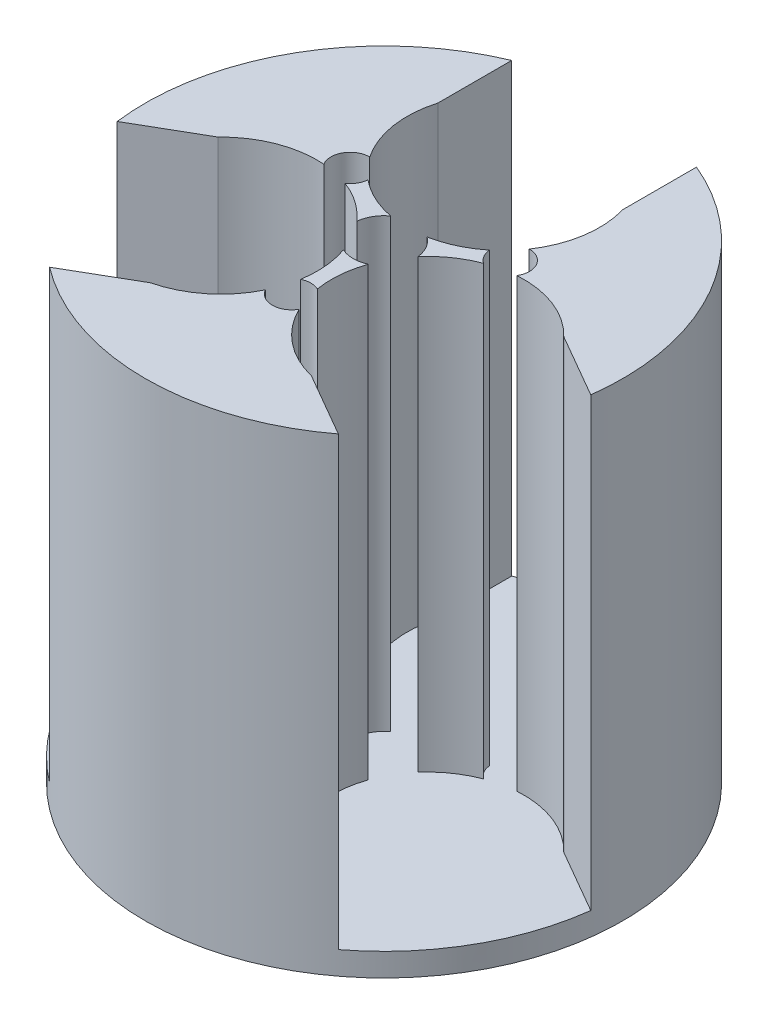
ISO-10303-21;
HEADER;
FILE_DESCRIPTION(('STEP AP214'),'2;1');
FILE_NAME('part.step','',(''),(''),'','','');
FILE_SCHEMA(('AUTOMOTIVE_DESIGN { 1 0 10303 214 1 1 1 1 }'));
ENDSEC;
DATA;
#1=APPLICATION_CONTEXT('core data for automotive mechanical design processes');
#2=APPLICATION_PROTOCOL_DEFINITION('international standard','automotive_design',2000,#1);
#3=PRODUCT_CONTEXT('',#1,'mechanical');
#4=PRODUCT('Part','Part','',(#3));
#5=PRODUCT_RELATED_PRODUCT_CATEGORY('part','',(#4));
#6=PRODUCT_DEFINITION_FORMATION('','',#4);
#7=PRODUCT_DEFINITION_CONTEXT('part definition',#1,'design');
#8=PRODUCT_DEFINITION('design','',#6,#7);
#9=PRODUCT_DEFINITION_SHAPE('','',#8);
#10=(LENGTH_UNIT() NAMED_UNIT(*) SI_UNIT(.MILLI.,.METRE.));
#11=(NAMED_UNIT(*) PLANE_ANGLE_UNIT() SI_UNIT($,.RADIAN.));
#12=(NAMED_UNIT(*) SI_UNIT($,.STERADIAN.) SOLID_ANGLE_UNIT());
#13=UNCERTAINTY_MEASURE_WITH_UNIT(LENGTH_MEASURE(1.E-05),#10,'distance_accuracy_value','');
#14=(GEOMETRIC_REPRESENTATION_CONTEXT(3) GLOBAL_UNCERTAINTY_ASSIGNED_CONTEXT((#13)) GLOBAL_UNIT_ASSIGNED_CONTEXT((#10,
#11,#12)) REPRESENTATION_CONTEXT('',''));
#15=CARTESIAN_POINT('',(0.,0.,0.));
#16=DIRECTION('',(0.,0.,1.));
#17=DIRECTION('',(1.,0.,0.));
#18=AXIS2_PLACEMENT_3D('',#15,#16,#17);
#19=CARTESIAN_POINT('',(0.,0.,0.));
#20=DIRECTION('',(0.,-1.,0.));
#21=DIRECTION('',(0.,0.,-1.));
#22=AXIS2_PLACEMENT_3D('',#19,#20,#21);
#23=PLANE('',#22);
#24=CARTESIAN_POINT('',(0.,0.,0.));
#25=DIRECTION('',(0.,1.,0.));
#26=DIRECTION('',(0.,0.,1.));
#27=AXIS2_PLACEMENT_3D('',#24,#25,#26);
#28=CIRCLE('',#27,4.);
#29=CARTESIAN_POINT('',(-2.36520035868689,0.,-3.2258064516129));
#30=VERTEX_POINT('',#29);
#31=CARTESIAN_POINT('',(-3.97623051413171,0.,-0.43542036985866));
#32=VERTEX_POINT('',#31);
#33=EDGE_CURVE('E417',#30,#32,#28,.T.);
#34=ORIENTED_EDGE('',*,*,#33,.T.);
#35=CARTESIAN_POINT('',(-13.4233937586578,0.,7.75000000000058));
#36=DIRECTION('',(0.,1.,0.));
#37=DIRECTION('',(0.,0.,1.));
#38=AXIS2_PLACEMENT_3D('',#35,#36,#37);
#39=CIRCLE('',#38,12.5000000000013);
#40=CARTESIAN_POINT('',(-8.98333784910684,0.,-3.93485787333673));
#41=VERTEX_POINT('',#40);
#42=EDGE_CURVE('E409',#32,#41,#39,.T.);
#43=ORIENTED_EDGE('',*,*,#42,.T.);
#44=CARTESIAN_POINT('',(-10.3923048454133,0.,-6.));
#45=DIRECTION('',(0.,1.,0.));
#46=DIRECTION('',(0.,0.,1.));
#47=AXIS2_PLACEMENT_3D('',#44,#45,#46);
#48=CIRCLE('',#47,2.5);
#49=CARTESIAN_POINT('',(-7.89935580314415,0.,-5.81236985143772));
#50=VERTEX_POINT('',#49);
#51=EDGE_CURVE('E413',#41,#50,#48,.T.);
#52=ORIENTED_EDGE('',*,*,#51,.T.);
#53=CARTESIAN_POINT('',(0.,0.,-15.5));
#54=DIRECTION('',(0.,1.,0.));
#55=DIRECTION('',(0.,0.,1.));
#56=AXIS2_PLACEMENT_3D('',#53,#54,#55);
#57=CIRCLE('',#56,12.5);
#58=EDGE_CURVE('E415',#50,#30,#57,.T.);
#59=ORIENTED_EDGE('',*,*,#58,.T.);
#60=EDGE_LOOP('',(#34,#43,#52,#59));
#61=FACE_BOUND('',#60,.T.);
#62=CARTESIAN_POINT('',(0.,0.,0.));
#63=DIRECTION('',(0.,1.,0.));
#64=DIRECTION('',(0.,0.,1.));
#65=AXIS2_PLACEMENT_3D('',#62,#63,#64);
#66=CIRCLE('',#65,4.);
#67=CARTESIAN_POINT('',(3.97623051413188,0.,-0.435420369857106));
#68=VERTEX_POINT('',#67);
#69=CARTESIAN_POINT('',(2.36520035868689,0.,-3.2258064516129));
#70=VERTEX_POINT('',#69);
#71=EDGE_CURVE('E12',#68,#70,#66,.T.);
#72=ORIENTED_EDGE('',*,*,#71,.T.);
#73=CARTESIAN_POINT('',(0.,0.,-15.5));
#74=DIRECTION('',(0.,1.,0.));
#75=DIRECTION('',(0.,0.,1.));
#76=AXIS2_PLACEMENT_3D('',#73,#74,#75);
#77=CIRCLE('',#76,12.5);
#78=CARTESIAN_POINT('',(7.89935580314417,0.,-5.81236985143774));
#79=VERTEX_POINT('',#78);
#80=EDGE_CURVE('E84',#70,#79,#77,.T.);
#81=ORIENTED_EDGE('',*,*,#80,.T.);
#82=CARTESIAN_POINT('',(10.3923048454133,0.,-5.99999999999995));
#83=DIRECTION('',(0.,1.,0.));
#84=DIRECTION('',(0.,0.,1.));
#85=AXIS2_PLACEMENT_3D('',#82,#83,#84);
#86=CIRCLE('',#85,2.5);
#87=CARTESIAN_POINT('',(8.98333784910686,0.,-3.9348578733367));
#88=VERTEX_POINT('',#87);
#89=EDGE_CURVE('E516',#79,#88,#86,.T.);
#90=ORIENTED_EDGE('',*,*,#89,.T.);
#91=CARTESIAN_POINT('',(13.4233937586598,0.,7.74999999999943));
#92=DIRECTION('',(0.,1.,0.));
#93=DIRECTION('',(0.,0.,1.));
#94=AXIS2_PLACEMENT_3D('',#91,#92,#93);
#95=CIRCLE('',#94,12.5000000000009);
#96=EDGE_CURVE('E89',#88,#68,#95,.T.);
#97=ORIENTED_EDGE('',*,*,#96,.T.);
#98=EDGE_LOOP('',(#72,#81,#90,#97));
#99=FACE_BOUND('',#98,.T.);
#100=DIRECTION('',(0.,0.,-1.));
#101=VECTOR('',#100,1.);
#102=CARTESIAN_POINT('',(12.0000000000007,0.,0.));
#103=LINE('',#102,#101);
#104=CARTESIAN_POINT('',(12.0000000000007,0.,-18.9999999999974));
#105=VERTEX_POINT('',#104);
#106=CARTESIAN_POINT('',(12.0000000000007,0.,-28.5832118559126));
#107=VERTEX_POINT('',#106);
#108=EDGE_CURVE('E430',#105,#107,#103,.T.);
#109=ORIENTED_EDGE('',*,*,#108,.T.);
#110=CARTESIAN_POINT('',(0.,0.,0.));
#111=DIRECTION('',(0.,-1.,0.));
#112=DIRECTION('',(0.,0.,-1.));
#113=AXIS2_PLACEMENT_3D('',#110,#111,#112);
#114=CIRCLE('',#113,31.);
#115=CARTESIAN_POINT('',(-11.9999999999992,0.,-28.5832118559132));
#116=VERTEX_POINT('',#115);
#117=EDGE_CURVE('E503',#116,#107,#114,.T.);
#118=ORIENTED_EDGE('',*,*,#117,.F.);
#119=DIRECTION('',(0.,0.,-1.));
#120=VECTOR('',#119,1.);
#121=CARTESIAN_POINT('',(-11.9999999999993,0.,0.));
#122=LINE('',#121,#120);
#123=CARTESIAN_POINT('',(-11.9999999999992,0.,-19.0000000000026));
#124=VERTEX_POINT('',#123);
#125=EDGE_CURVE('E288',#124,#116,#122,.T.);
#126=ORIENTED_EDGE('',*,*,#125,.F.);
#127=CARTESIAN_POINT('',(0.,0.,-15.5));
#128=DIRECTION('',(0.,1.,0.));
#129=DIRECTION('',(0.,0.,1.));
#130=AXIS2_PLACEMENT_3D('',#127,#128,#129);
#131=CIRCLE('',#130,12.5);
#132=CARTESIAN_POINT('',(-10.3559791901228,0.,-8.49973607542231));
#133=VERTEX_POINT('',#132);
#134=EDGE_CURVE('E284',#124,#133,#131,.T.);
#135=ORIENTED_EDGE('',*,*,#134,.T.);
#136=CARTESIAN_POINT('',(-10.3923048454133,0.,-6.));
#137=DIRECTION('',(0.,1.,0.));
#138=DIRECTION('',(0.,0.,1.));
#139=AXIS2_PLACEMENT_3D('',#136,#137,#138);
#140=CIRCLE('',#139,2.5);
#141=CARTESIAN_POINT('',(-12.5389769618406,0.,-4.71867302199896));
#142=VERTEX_POINT('',#141);
#143=EDGE_CURVE('E494',#133,#142,#140,.T.);
#144=ORIENTED_EDGE('',*,*,#143,.T.);
#145=CARTESIAN_POINT('',(-13.4233937586578,0.,7.75000000000058));
#146=DIRECTION('',(0.,1.,0.));
#147=DIRECTION('',(0.,0.,1.));
#148=AXIS2_PLACEMENT_3D('',#145,#146,#147);
#149=CIRCLE('',#148,12.5000000000013);
#150=CARTESIAN_POINT('',(-22.4544826719048,0.,-0.892304845413021));
#151=VERTEX_POINT('',#150);
#152=EDGE_CURVE('E489',#142,#151,#149,.T.);
#153=ORIENTED_EDGE('',*,*,#152,.T.);
#154=DIRECTION('',(-0.866025403784439,0.,0.5));
#155=VECTOR('',#154,1.);
#156=CARTESIAN_POINT('',(-6.,0.,-10.3923048454133));
#157=LINE('',#156,#155);
#158=CARTESIAN_POINT('',(-30.7537875889731,0.,3.89930108254319));
#159=VERTEX_POINT('',#158);
#160=EDGE_CURVE('E485',#151,#159,#157,.T.);
#161=ORIENTED_EDGE('',*,*,#160,.T.);
#162=CARTESIAN_POINT('',(-18.7537875889731,0.,24.6839107733697));
#163=VERTEX_POINT('',#162);
#164=EDGE_CURVE('E488',#163,#159,#114,.T.);
#165=ORIENTED_EDGE('',*,*,#164,.F.);
#166=DIRECTION('',(-0.866025403784439,0.,0.5));
#167=VECTOR('',#166,1.);
#168=CARTESIAN_POINT('',(6.,0.,10.3923048454133));
#169=LINE('',#168,#167);
#170=CARTESIAN_POINT('',(-10.4544826719107,0.,19.8923048454169));
#171=VERTEX_POINT('',#170);
#172=EDGE_CURVE('E460',#171,#163,#169,.T.);
#173=ORIENTED_EDGE('',*,*,#172,.F.);
#174=CARTESIAN_POINT('',(-13.4233937586578,0.,7.75000000000058));
#175=DIRECTION('',(0.,1.,0.));
#176=DIRECTION('',(0.,0.,1.));
#177=AXIS2_PLACEMENT_3D('',#174,#175,#176);
#178=CIRCLE('',#177,12.5000000000013);
#179=CARTESIAN_POINT('',(-2.18299777171577,0.,13.2184090974227));
#180=VERTEX_POINT('',#179);
#181=EDGE_CURVE('E466',#171,#180,#178,.T.);
#182=ORIENTED_EDGE('',*,*,#181,.T.);
#183=CARTESIAN_POINT('',(5.25026777861091E-13,0.,11.9999999999997));
#184=DIRECTION('',(0.,1.,0.));
#185=DIRECTION('',(0.,0.,1.));
#186=AXIS2_PLACEMENT_3D('',#183,#184,#185);
#187=CIRCLE('',#186,2.50000000000026);
#188=CARTESIAN_POINT('',(2.18299777171785,0.,13.2184090974208));
#189=VERTEX_POINT('',#188);
#190=EDGE_CURVE('E473',#180,#189,#187,.T.);
#191=ORIENTED_EDGE('',*,*,#190,.T.);
#192=CARTESIAN_POINT('',(13.4233937586598,0.,7.74999999999943));
#193=DIRECTION('',(0.,1.,0.));
#194=DIRECTION('',(0.,0.,1.));
#195=AXIS2_PLACEMENT_3D('',#192,#193,#194);
#196=CIRCLE('',#195,12.5000000000009);
#197=CARTESIAN_POINT('',(10.4544826719071,0.,19.892304845414));
#198=VERTEX_POINT('',#197);
#199=EDGE_CURVE('E469',#189,#198,#196,.T.);
#200=ORIENTED_EDGE('',*,*,#199,.T.);
#201=DIRECTION('',(0.866025403784439,0.,0.5));
#202=VECTOR('',#201,1.);
#203=CARTESIAN_POINT('',(-5.99999999999963,0.,10.3923048454126));
#204=LINE('',#203,#202);
#205=CARTESIAN_POINT('',(18.7537875889738,0.,24.6839107733692));
#206=VERTEX_POINT('',#205);
#207=EDGE_CURVE('E454',#198,#206,#204,.T.);
#208=ORIENTED_EDGE('',*,*,#207,.T.);
#209=CARTESIAN_POINT('',(30.7537875889732,0.,3.8993010825424));
#210=VERTEX_POINT('',#209);
#211=EDGE_CURVE('E506',#210,#206,#114,.T.);
#212=ORIENTED_EDGE('',*,*,#211,.F.);
#213=DIRECTION('',(0.866025403784439,0.,0.5));
#214=VECTOR('',#213,1.);
#215=CARTESIAN_POINT('',(6.00000000000037,0.,-10.3923048454139));
#216=LINE('',#215,#214);
#217=CARTESIAN_POINT('',(22.4544826719086,0.,-0.892304845411653));
#218=VERTEX_POINT('',#217);
#219=EDGE_CURVE('E425',#218,#210,#216,.T.);
#220=ORIENTED_EDGE('',*,*,#219,.F.);
#221=CARTESIAN_POINT('',(13.4233937586598,0.,7.74999999999943));
#222=DIRECTION('',(0.,1.,0.));
#223=DIRECTION('',(0.,0.,1.));
#224=AXIS2_PLACEMENT_3D('',#221,#222,#223);
#225=CIRCLE('',#224,12.5000000000009);
#226=CARTESIAN_POINT('',(12.5389769618411,0.,-4.71867302199959));
#227=VERTEX_POINT('',#226);
#228=EDGE_CURVE('E435',#218,#227,#225,.T.);
#229=ORIENTED_EDGE('',*,*,#228,.T.);
#230=CARTESIAN_POINT('',(10.3923048454133,0.,-5.99999999999995));
#231=DIRECTION('',(0.,1.,0.));
#232=DIRECTION('',(0.,0.,1.));
#233=AXIS2_PLACEMENT_3D('',#230,#231,#232);
#234=CIRCLE('',#233,2.5);
#235=CARTESIAN_POINT('',(10.3559791901228,0.,-8.49973607542226));
#236=VERTEX_POINT('',#235);
#237=EDGE_CURVE('E419',#227,#236,#234,.T.);
#238=ORIENTED_EDGE('',*,*,#237,.T.);
#239=CARTESIAN_POINT('',(0.,0.,-15.5));
#240=DIRECTION('',(0.,1.,0.));
#241=DIRECTION('',(0.,0.,1.));
#242=AXIS2_PLACEMENT_3D('',#239,#240,#241);
#243=CIRCLE('',#242,12.5);
#244=EDGE_CURVE('E438',#236,#105,#243,.T.);
#245=ORIENTED_EDGE('',*,*,#244,.T.);
#246=EDGE_LOOP('',(#109,#118,#126,#135,#144,#153,#161,#165,#173,#182,#191,#200,#208,#212,#220,
#229,#238,#245));
#247=FACE_BOUND('',#246,.T.);
#248=CARTESIAN_POINT('',(0.,0.,0.));
#249=DIRECTION('',(0.,1.,0.));
#250=DIRECTION('',(0.,0.,1.));
#251=AXIS2_PLACEMENT_3D('',#248,#249,#250);
#252=CIRCLE('',#251,4.);
#253=CARTESIAN_POINT('',(-1.61103015544257,0.,3.66122682147046));
#254=VERTEX_POINT('',#253);
#255=CARTESIAN_POINT('',(1.61103015544494,0.,3.66122682146942));
#256=VERTEX_POINT('',#255);
#257=EDGE_CURVE('E101',#254,#256,#252,.T.);
#258=ORIENTED_EDGE('',*,*,#257,.T.);
#259=CARTESIAN_POINT('',(13.4233937586598,0.,7.74999999999943));
#260=DIRECTION('',(0.,1.,0.));
#261=DIRECTION('',(0.,0.,1.));
#262=AXIS2_PLACEMENT_3D('',#259,#260,#261);
#263=CIRCLE('',#262,12.5000000000009);
#264=CARTESIAN_POINT('',(1.08398204596386,0.,9.74722772477293));
#265=VERTEX_POINT('',#264);
#266=EDGE_CURVE('E396',#256,#265,#263,.T.);
#267=ORIENTED_EDGE('',*,*,#266,.T.);
#268=CARTESIAN_POINT('',(5.25026777861091E-13,0.,11.9999999999997));
#269=DIRECTION('',(0.,1.,0.));
#270=DIRECTION('',(0.,0.,1.));
#271=AXIS2_PLACEMENT_3D('',#268,#269,#270);
#272=CIRCLE('',#271,2.50000000000026);
#273=CARTESIAN_POINT('',(-1.08398204596116,0.,9.74722772477213));
#274=VERTEX_POINT('',#273);
#275=EDGE_CURVE('E400',#265,#274,#272,.T.);
#276=ORIENTED_EDGE('',*,*,#275,.T.);
#277=CARTESIAN_POINT('',(-13.4233937586578,0.,7.75000000000058));
#278=DIRECTION('',(0.,1.,0.));
#279=DIRECTION('',(0.,0.,1.));
#280=AXIS2_PLACEMENT_3D('',#277,#278,#279);
#281=CIRCLE('',#280,12.5000000000013);
#282=EDGE_CURVE('E97',#274,#254,#281,.T.);
#283=ORIENTED_EDGE('',*,*,#282,.T.);
#284=EDGE_LOOP('',(#258,#267,#276,#283));
#285=FACE_BOUND('',#284,.T.);
#286=ADVANCED_FACE('F80',(#61,#99,#247,#285),#23,.F.);
#287=CARTESIAN_POINT('',(13.4233937586598,0.,7.74999999999943));
#288=DIRECTION('',(0.,1.,0.));
#289=DIRECTION('',(0.,0.,1.));
#290=AXIS2_PLACEMENT_3D('',#287,#288,#289);
#291=CYLINDRICAL_SURFACE('',#290,12.5000000000009);
#292=ORIENTED_EDGE('',*,*,#96,.F.);
#293=DIRECTION('',(0.,1.,0.));
#294=VECTOR('',#293,1.);
#295=CARTESIAN_POINT('',(8.98333784910685,25.,-3.93485787333671));
#296=LINE('',#295,#294);
#297=CARTESIAN_POINT('',(8.98333784910686,58.,-3.9348578733367));
#298=VERTEX_POINT('',#297);
#299=EDGE_CURVE('E502',#88,#298,#296,.T.);
#300=ORIENTED_EDGE('',*,*,#299,.T.);
#301=CARTESIAN_POINT('',(13.4233937586598,58.,7.74999999999943));
#302=DIRECTION('',(0.,-1.,0.));
#303=DIRECTION('',(0.,0.,1.));
#304=AXIS2_PLACEMENT_3D('',#301,#302,#303);
#305=CIRCLE('',#304,12.5000000000009);
#306=CARTESIAN_POINT('',(3.97623051413189,58.,-0.435420369857109));
#307=VERTEX_POINT('',#306);
#308=EDGE_CURVE('E332',#307,#298,#305,.T.);
#309=ORIENTED_EDGE('',*,*,#308,.F.);
#310=DIRECTION('',(0.,1.,0.));
#311=VECTOR('',#310,1.);
#312=CARTESIAN_POINT('',(3.97623051413188,25.,-0.435420369857106));
#313=LINE('',#312,#311);
#314=EDGE_CURVE('E508',#307,#68,#313,.F.);
#315=ORIENTED_EDGE('',*,*,#314,.T.);
#316=EDGE_LOOP('',(#292,#300,#309,#315));
#317=FACE_BOUND('',#316,.T.);
#318=ADVANCED_FACE('F524',(#317),#291,.F.);
#319=CARTESIAN_POINT('',(0.,0.,-15.5));
#320=DIRECTION('',(0.,1.,0.));
#321=DIRECTION('',(0.,0.,1.));
#322=AXIS2_PLACEMENT_3D('',#319,#320,#321);
#323=CYLINDRICAL_SURFACE('',#322,12.5);
#324=DIRECTION('',(0.,1.,0.));
#325=VECTOR('',#324,1.);
#326=CARTESIAN_POINT('',(2.36520035868689,25.,-3.2258064516129));
#327=LINE('',#326,#325);
#328=CARTESIAN_POINT('',(2.36520035868689,58.,-3.2258064516129));
#329=VERTEX_POINT('',#328);
#330=EDGE_CURVE('E512',#70,#329,#327,.T.);
#331=ORIENTED_EDGE('',*,*,#330,.T.);
#332=CARTESIAN_POINT('',(0.,58.,-15.5));
#333=DIRECTION('',(0.,-1.,0.));
#334=DIRECTION('',(0.,0.,1.));
#335=AXIS2_PLACEMENT_3D('',#332,#333,#334);
#336=CIRCLE('',#335,12.5);
#337=CARTESIAN_POINT('',(7.89935580314417,58.,-5.81236985143774));
#338=VERTEX_POINT('',#337);
#339=EDGE_CURVE('E326',#338,#329,#336,.T.);
#340=ORIENTED_EDGE('',*,*,#339,.F.);
#341=DIRECTION('',(0.,1.,0.));
#342=VECTOR('',#341,1.);
#343=CARTESIAN_POINT('',(7.89935580314417,25.,-5.81236985143773));
#344=LINE('',#343,#342);
#345=EDGE_CURVE('E509',#338,#79,#344,.F.);
#346=ORIENTED_EDGE('',*,*,#345,.T.);
#347=ORIENTED_EDGE('',*,*,#80,.F.);
#348=EDGE_LOOP('',(#331,#340,#346,#347));
#349=FACE_BOUND('',#348,.T.);
#350=ADVANCED_FACE('F82',(#349),#323,.F.);
#351=CARTESIAN_POINT('',(0.,0.,0.));
#352=DIRECTION('',(0.,1.,0.));
#353=DIRECTION('',(0.,0.,1.));
#354=AXIS2_PLACEMENT_3D('',#351,#352,#353);
#355=CYLINDRICAL_SURFACE('',#354,4.);
#356=ORIENTED_EDGE('',*,*,#71,.F.);
#357=ORIENTED_EDGE('',*,*,#314,.F.);
#358=CARTESIAN_POINT('',(0.,58.,0.));
#359=DIRECTION('',(0.,-1.,0.));
#360=DIRECTION('',(0.,0.,1.));
#361=AXIS2_PLACEMENT_3D('',#358,#359,#360);
#362=CIRCLE('',#361,4.);
#363=EDGE_CURVE('E329',#329,#307,#362,.T.);
#364=ORIENTED_EDGE('',*,*,#363,.F.);
#365=ORIENTED_EDGE('',*,*,#330,.F.);
#366=EDGE_LOOP('',(#356,#357,#364,#365));
#367=FACE_BOUND('',#366,.T.);
#368=ADVANCED_FACE('F528',(#367),#355,.F.);
#369=CARTESIAN_POINT('',(10.3923048454133,0.,-5.99999999999995));
#370=DIRECTION('',(0.,1.,0.));
#371=DIRECTION('',(0.,0.,1.));
#372=AXIS2_PLACEMENT_3D('',#369,#370,#371);
#373=CYLINDRICAL_SURFACE('',#372,2.5);
#374=ORIENTED_EDGE('',*,*,#345,.F.);
#375=CARTESIAN_POINT('',(10.3923048454133,58.,-5.99999999999995));
#376=DIRECTION('',(0.,-1.,0.));
#377=DIRECTION('',(0.,0.,1.));
#378=AXIS2_PLACEMENT_3D('',#375,#376,#377);
#379=CIRCLE('',#378,2.5);
#380=EDGE_CURVE('E335',#298,#338,#379,.T.);
#381=ORIENTED_EDGE('',*,*,#380,.F.);
#382=ORIENTED_EDGE('',*,*,#299,.F.);
#383=ORIENTED_EDGE('',*,*,#89,.F.);
#384=EDGE_LOOP('',(#374,#381,#382,#383));
#385=FACE_BOUND('',#384,.T.);
#386=ADVANCED_FACE('F536',(#385),#373,.F.);
#387=CARTESIAN_POINT('',(0.,-3.,0.));
#388=DIRECTION('',(0.,1.,0.));
#389=DIRECTION('',(0.,0.,1.));
#390=AXIS2_PLACEMENT_3D('',#387,#388,#389);
#391=CYLINDRICAL_SURFACE('',#390,31.);
#392=CARTESIAN_POINT('',(0.,-3.,0.));
#393=DIRECTION('',(0.,-1.,0.));
#394=DIRECTION('',(0.,0.,-1.));
#395=AXIS2_PLACEMENT_3D('',#392,#393,#394);
#396=CIRCLE('',#395,31.);
#397=CARTESIAN_POINT('',(0.,-3.,-31.));
#398=VERTEX_POINT('',#397);
#399=EDGE_CURVE('E499',#398,#398,#396,.T.);
#400=ORIENTED_EDGE('',*,*,#399,.F.);
#401=EDGE_LOOP('',(#400));
#402=FACE_BOUND('',#401,.T.);
#403=ORIENTED_EDGE('',*,*,#117,.T.);
#404=DIRECTION('',(0.,1.,0.));
#405=VECTOR('',#404,1.);
#406=CARTESIAN_POINT('',(12.0000000000007,0.,-28.5832118559126));
#407=LINE('',#406,#405);
#408=CARTESIAN_POINT('',(12.0000000000007,58.,-28.5832118559126));
#409=VERTEX_POINT('',#408);
#410=EDGE_CURVE('E433',#107,#409,#407,.T.);
#411=ORIENTED_EDGE('',*,*,#410,.T.);
#412=CARTESIAN_POINT('',(0.,58.,0.));
#413=DIRECTION('',(0.,1.,0.));
#414=DIRECTION('',(0.,0.,1.));
#415=AXIS2_PLACEMENT_3D('',#412,#413,#414);
#416=CIRCLE('',#415,31.);
#417=CARTESIAN_POINT('',(30.7537875889732,58.,3.8993010825424));
#418=VERTEX_POINT('',#417);
#419=EDGE_CURVE('E344',#418,#409,#416,.T.);
#420=ORIENTED_EDGE('',*,*,#419,.F.);
#421=DIRECTION('',(0.,1.,0.));
#422=VECTOR('',#421,1.);
#423=CARTESIAN_POINT('',(30.7537875889732,0.,3.8993010825424));
#424=LINE('',#423,#422);
#425=EDGE_CURVE('E428',#210,#418,#424,.T.);
#426=ORIENTED_EDGE('',*,*,#425,.F.);
#427=ORIENTED_EDGE('',*,*,#211,.T.);
#428=DIRECTION('',(0.,1.,0.));
#429=VECTOR('',#428,1.);
#430=CARTESIAN_POINT('',(18.7537875889738,0.,24.6839107733692));
#431=LINE('',#430,#429);
#432=CARTESIAN_POINT('',(18.7537875889738,58.,24.6839107733692));
#433=VERTEX_POINT('',#432);
#434=EDGE_CURVE('E458',#206,#433,#431,.T.);
#435=ORIENTED_EDGE('',*,*,#434,.T.);
#436=CARTESIAN_POINT('',(0.,58.,0.));
#437=DIRECTION('',(0.,1.,0.));
#438=DIRECTION('',(0.,0.,1.));
#439=AXIS2_PLACEMENT_3D('',#436,#437,#438);
#440=CIRCLE('',#439,31.);
#441=CARTESIAN_POINT('',(-18.7537875889731,58.,24.6839107733697));
#442=VERTEX_POINT('',#441);
#443=EDGE_CURVE('E374',#442,#433,#440,.T.);
#444=ORIENTED_EDGE('',*,*,#443,.F.);
#445=DIRECTION('',(0.,1.,0.));
#446=VECTOR('',#445,1.);
#447=CARTESIAN_POINT('',(-18.7537875889731,0.,24.6839107733697));
#448=LINE('',#447,#446);
#449=EDGE_CURVE('E461',#163,#442,#448,.T.);
#450=ORIENTED_EDGE('',*,*,#449,.F.);
#451=ORIENTED_EDGE('',*,*,#164,.T.);
#452=DIRECTION('',(0.,1.,0.));
#453=VECTOR('',#452,1.);
#454=CARTESIAN_POINT('',(-30.7537875889731,0.,3.89930108254319));
#455=LINE('',#454,#453);
#456=CARTESIAN_POINT('',(-30.7537875889731,58.,3.89930108254319));
#457=VERTEX_POINT('',#456);
#458=EDGE_CURVE('E289',#159,#457,#455,.T.);
#459=ORIENTED_EDGE('',*,*,#458,.T.);
#460=CARTESIAN_POINT('',(0.,58.,0.));
#461=DIRECTION('',(0.,1.,0.));
#462=DIRECTION('',(0.,0.,1.));
#463=AXIS2_PLACEMENT_3D('',#460,#461,#462);
#464=CIRCLE('',#463,31.);
#465=CARTESIAN_POINT('',(-11.9999999999992,58.,-28.5832118559132));
#466=VERTEX_POINT('',#465);
#467=EDGE_CURVE('E298',#466,#457,#464,.T.);
#468=ORIENTED_EDGE('',*,*,#467,.F.);
#469=DIRECTION('',(0.,1.,0.));
#470=VECTOR('',#469,1.);
#471=CARTESIAN_POINT('',(-11.9999999999992,0.,-28.5832118559132));
#472=LINE('',#471,#470);
#473=EDGE_CURVE('E294',#116,#466,#472,.T.);
#474=ORIENTED_EDGE('',*,*,#473,.F.);
#475=EDGE_LOOP('',(#403,#411,#420,#426,#427,#435,#444,#450,#451,#459,#468,#474));
#476=FACE_BOUND('',#475,.T.);
#477=ADVANCED_FACE('F538',(#402,#476),#391,.T.);
#478=CARTESIAN_POINT('',(0.,-3.,0.));
#479=DIRECTION('',(0.,-1.,0.));
#480=DIRECTION('',(0.,0.,-1.));
#481=AXIS2_PLACEMENT_3D('',#478,#479,#480);
#482=PLANE('',#481);
#483=ORIENTED_EDGE('',*,*,#399,.T.);
#484=EDGE_LOOP('',(#483));
#485=FACE_BOUND('',#484,.T.);
#486=ADVANCED_FACE('F544',(#485),#482,.T.);
#487=CARTESIAN_POINT('',(-11.9999999999993,0.,0.));
#488=DIRECTION('',(1.,0.,0.));
#489=DIRECTION('',(0.,0.,-1.));
#490=AXIS2_PLACEMENT_3D('',#487,#488,#489);
#491=PLANE('',#490);
#492=DIRECTION('',(0.,1.,0.));
#493=VECTOR('',#492,1.);
#494=CARTESIAN_POINT('',(-11.9999999999992,0.,-19.0000000000026));
#495=LINE('',#494,#493);
#496=CARTESIAN_POINT('',(-11.9999999999992,58.,-19.0000000000026));
#497=VERTEX_POINT('',#496);
#498=EDGE_CURVE('E277',#497,#124,#495,.F.);
#499=ORIENTED_EDGE('',*,*,#498,.T.);
#500=ORIENTED_EDGE('',*,*,#125,.T.);
#501=ORIENTED_EDGE('',*,*,#473,.T.);
#502=DIRECTION('',(0.,0.,-1.));
#503=VECTOR('',#502,1.);
#504=CARTESIAN_POINT('',(-11.9999999999992,58.,-19.0000000000026));
#505=LINE('',#504,#503);
#506=EDGE_CURVE('E292',#497,#466,#505,.T.);
#507=ORIENTED_EDGE('',*,*,#506,.F.);
#508=EDGE_LOOP('',(#499,#500,#501,#507));
#509=FACE_BOUND('',#508,.T.);
#510=ADVANCED_FACE('F293',(#509),#491,.T.);
#511=CARTESIAN_POINT('',(-6.,0.,-10.3923048454133));
#512=DIRECTION('',(-0.5,0.,-0.866025403784439));
#513=DIRECTION('',(-0.866025403784439,0.,0.5));
#514=AXIS2_PLACEMENT_3D('',#511,#512,#513);
#515=PLANE('',#514);
#516=DIRECTION('',(0.,1.,0.));
#517=VECTOR('',#516,1.);
#518=CARTESIAN_POINT('',(-22.4544826719048,0.,-0.892304845413009));
#519=LINE('',#518,#517);
#520=CARTESIAN_POINT('',(-22.4544826719048,58.,-0.892304845413023));
#521=VERTEX_POINT('',#520);
#522=EDGE_CURVE('E479',#521,#151,#519,.F.);
#523=ORIENTED_EDGE('',*,*,#522,.F.);
#524=DIRECTION('',(0.866025403784439,0.,-0.5));
#525=VECTOR('',#524,1.);
#526=CARTESIAN_POINT('',(-30.7537875889731,58.,3.89930108254319));
#527=LINE('',#526,#525);
#528=EDGE_CURVE('E308',#457,#521,#527,.T.);
#529=ORIENTED_EDGE('',*,*,#528,.F.);
#530=ORIENTED_EDGE('',*,*,#458,.F.);
#531=ORIENTED_EDGE('',*,*,#160,.F.);
#532=EDGE_LOOP('',(#523,#529,#530,#531));
#533=FACE_BOUND('',#532,.T.);
#534=ADVANCED_FACE('F566',(#533),#515,.F.);
#535=CARTESIAN_POINT('',(-13.4233937586578,0.,7.75000000000058));
#536=DIRECTION('',(0.,1.,0.));
#537=DIRECTION('',(0.,0.,1.));
#538=AXIS2_PLACEMENT_3D('',#535,#536,#537);
#539=CYLINDRICAL_SURFACE('',#538,12.5000000000013);
#540=ORIENTED_EDGE('',*,*,#152,.F.);
#541=DIRECTION('',(0.,1.,0.));
#542=VECTOR('',#541,1.);
#543=CARTESIAN_POINT('',(-12.5389769618406,25.,-4.71867302199895));
#544=LINE('',#543,#542);
#545=CARTESIAN_POINT('',(-12.5389769618406,58.,-4.71867302199896));
#546=VERTEX_POINT('',#545);
#547=EDGE_CURVE('E478',#142,#546,#544,.T.);
#548=ORIENTED_EDGE('',*,*,#547,.T.);
#549=CARTESIAN_POINT('',(-13.4233937586578,58.,7.75000000000058));
#550=DIRECTION('',(0.,-1.,0.));
#551=DIRECTION('',(0.,0.,1.));
#552=AXIS2_PLACEMENT_3D('',#549,#550,#551);
#553=CIRCLE('',#552,12.5000000000013);
#554=EDGE_CURVE('E311',#521,#546,#553,.T.);
#555=ORIENTED_EDGE('',*,*,#554,.F.);
#556=ORIENTED_EDGE('',*,*,#522,.T.);
#557=EDGE_LOOP('',(#540,#548,#555,#556));
#558=FACE_BOUND('',#557,.T.);
#559=ADVANCED_FACE('F563',(#558),#539,.F.);
#560=CARTESIAN_POINT('',(0.,0.,-15.5));
#561=DIRECTION('',(0.,1.,0.));
#562=DIRECTION('',(0.,0.,1.));
#563=AXIS2_PLACEMENT_3D('',#560,#561,#562);
#564=CYLINDRICAL_SURFACE('',#563,12.5);
#565=ORIENTED_EDGE('',*,*,#498,.F.);
#566=CARTESIAN_POINT('',(0.,58.,-15.5));
#567=DIRECTION('',(0.,-1.,0.));
#568=DIRECTION('',(0.,0.,1.));
#569=AXIS2_PLACEMENT_3D('',#566,#567,#568);
#570=CIRCLE('',#569,12.5);
#571=CARTESIAN_POINT('',(-10.3559791901228,58.,-8.49973607542231));
#572=VERTEX_POINT('',#571);
#573=EDGE_CURVE('E282',#572,#497,#570,.T.);
#574=ORIENTED_EDGE('',*,*,#573,.F.);
#575=DIRECTION('',(0.,1.,0.));
#576=VECTOR('',#575,1.);
#577=CARTESIAN_POINT('',(-10.3559791901228,25.,-8.49973607542231));
#578=LINE('',#577,#576);
#579=EDGE_CURVE('E483',#572,#133,#578,.F.);
#580=ORIENTED_EDGE('',*,*,#579,.T.);
#581=ORIENTED_EDGE('',*,*,#134,.F.);
#582=EDGE_LOOP('',(#565,#574,#580,#581));
#583=FACE_BOUND('',#582,.T.);
#584=ADVANCED_FACE('F279',(#583),#564,.F.);
#585=CARTESIAN_POINT('',(-10.3923048454133,0.,-6.));
#586=DIRECTION('',(0.,1.,0.));
#587=DIRECTION('',(0.,0.,1.));
#588=AXIS2_PLACEMENT_3D('',#585,#586,#587);
#589=CYLINDRICAL_SURFACE('',#588,2.5);
#590=ORIENTED_EDGE('',*,*,#579,.F.);
#591=CARTESIAN_POINT('',(-10.3923048454133,58.,-6.));
#592=DIRECTION('',(0.,-1.,0.));
#593=DIRECTION('',(0.,0.,1.));
#594=AXIS2_PLACEMENT_3D('',#591,#592,#593);
#595=CIRCLE('',#594,2.5);
#596=EDGE_CURVE('E304',#546,#572,#595,.T.);
#597=ORIENTED_EDGE('',*,*,#596,.F.);
#598=ORIENTED_EDGE('',*,*,#547,.F.);
#599=ORIENTED_EDGE('',*,*,#143,.F.);
#600=EDGE_LOOP('',(#590,#597,#598,#599));
#601=FACE_BOUND('',#600,.T.);
#602=ADVANCED_FACE('F558',(#601),#589,.F.);
#603=CARTESIAN_POINT('',(13.4233937586598,0.,7.74999999999943));
#604=DIRECTION('',(0.,1.,0.));
#605=DIRECTION('',(0.,0.,1.));
#606=AXIS2_PLACEMENT_3D('',#603,#604,#605);
#607=CYLINDRICAL_SURFACE('',#606,12.5000000000009);
#608=ORIENTED_EDGE('',*,*,#199,.F.);
#609=DIRECTION('',(0.,1.,0.));
#610=VECTOR('',#609,1.);
#611=CARTESIAN_POINT('',(2.18299777171785,25.,13.2184090974208));
#612=LINE('',#611,#610);
#613=CARTESIAN_POINT('',(2.18299777171785,58.,13.2184090974208));
#614=VERTEX_POINT('',#613);
#615=EDGE_CURVE('E449',#189,#614,#612,.T.);
#616=ORIENTED_EDGE('',*,*,#615,.T.);
#617=CARTESIAN_POINT('',(13.4233937586598,58.,7.74999999999943));
#618=DIRECTION('',(0.,-1.,0.));
#619=DIRECTION('',(0.,0.,1.));
#620=AXIS2_PLACEMENT_3D('',#617,#618,#619);
#621=CIRCLE('',#620,12.5000000000009);
#622=CARTESIAN_POINT('',(10.4544826719071,58.,19.892304845414));
#623=VERTEX_POINT('',#622);
#624=EDGE_CURVE('E380',#623,#614,#621,.T.);
#625=ORIENTED_EDGE('',*,*,#624,.F.);
#626=DIRECTION('',(0.,1.,0.));
#627=VECTOR('',#626,1.);
#628=CARTESIAN_POINT('',(10.4544826719071,0.,19.892304845414));
#629=LINE('',#628,#627);
#630=EDGE_CURVE('E455',#623,#198,#629,.F.);
#631=ORIENTED_EDGE('',*,*,#630,.T.);
#632=EDGE_LOOP('',(#608,#616,#625,#631));
#633=FACE_BOUND('',#632,.T.);
#634=ADVANCED_FACE('F561',(#633),#607,.F.);
#635=CARTESIAN_POINT('',(-13.4233937586578,0.,7.75000000000058));
#636=DIRECTION('',(0.,1.,0.));
#637=DIRECTION('',(0.,0.,1.));
#638=AXIS2_PLACEMENT_3D('',#635,#636,#637);
#639=CYLINDRICAL_SURFACE('',#638,12.5000000000013);
#640=DIRECTION('',(0.,1.,0.));
#641=VECTOR('',#640,1.);
#642=CARTESIAN_POINT('',(-10.4544826719107,0.,19.8923048454169));
#643=LINE('',#642,#641);
#644=CARTESIAN_POINT('',(-10.4544826719107,58.,19.8923048454169));
#645=VERTEX_POINT('',#644);
#646=EDGE_CURVE('E453',#645,#171,#643,.F.);
#647=ORIENTED_EDGE('',*,*,#646,.F.);
#648=CARTESIAN_POINT('',(-13.4233937586578,58.,7.75000000000058));
#649=DIRECTION('',(0.,-1.,0.));
#650=DIRECTION('',(0.,0.,1.));
#651=AXIS2_PLACEMENT_3D('',#648,#649,#650);
#652=CIRCLE('',#651,12.5000000000013);
#653=CARTESIAN_POINT('',(-2.18299777171577,58.,13.2184090974227));
#654=VERTEX_POINT('',#653);
#655=EDGE_CURVE('E368',#654,#645,#652,.T.);
#656=ORIENTED_EDGE('',*,*,#655,.F.);
#657=DIRECTION('',(0.,1.,0.));
#658=VECTOR('',#657,1.);
#659=CARTESIAN_POINT('',(-2.18299777171577,25.,13.2184090974227));
#660=LINE('',#659,#658);
#661=EDGE_CURVE('E450',#654,#180,#660,.F.);
#662=ORIENTED_EDGE('',*,*,#661,.T.);
#663=ORIENTED_EDGE('',*,*,#181,.F.);
#664=EDGE_LOOP('',(#647,#656,#662,#663));
#665=FACE_BOUND('',#664,.T.);
#666=ADVANCED_FACE('F583',(#665),#639,.F.);
#667=CARTESIAN_POINT('',(6.,0.,10.3923048454133));
#668=DIRECTION('',(-0.5,0.,-0.866025403784439));
#669=DIRECTION('',(-0.866025403784439,0.,0.5));
#670=AXIS2_PLACEMENT_3D('',#667,#668,#669);
#671=PLANE('',#670);
#672=ORIENTED_EDGE('',*,*,#646,.T.);
#673=ORIENTED_EDGE('',*,*,#172,.T.);
#674=ORIENTED_EDGE('',*,*,#449,.T.);
#675=DIRECTION('',(-0.866025403784439,0.,0.5));
#676=VECTOR('',#675,1.);
#677=CARTESIAN_POINT('',(-10.4544826719107,58.,19.8923048454169));
#678=LINE('',#677,#676);
#679=EDGE_CURVE('E371',#645,#442,#678,.T.);
#680=ORIENTED_EDGE('',*,*,#679,.F.);
#681=EDGE_LOOP('',(#672,#673,#674,#680));
#682=FACE_BOUND('',#681,.T.);
#683=ADVANCED_FACE('F587',(#682),#671,.T.);
#684=CARTESIAN_POINT('',(-5.99999999999963,0.,10.3923048454126));
#685=DIRECTION('',(-0.5,0.,0.866025403784439));
#686=DIRECTION('',(0.866025403784439,0.,0.5));
#687=AXIS2_PLACEMENT_3D('',#684,#685,#686);
#688=PLANE('',#687);
#689=ORIENTED_EDGE('',*,*,#630,.F.);
#690=DIRECTION('',(-0.866025403784439,0.,-0.499999999999999));
#691=VECTOR('',#690,1.);
#692=CARTESIAN_POINT('',(18.7537875889738,58.,24.6839107733692));
#693=LINE('',#692,#691);
#694=EDGE_CURVE('E377',#433,#623,#693,.T.);
#695=ORIENTED_EDGE('',*,*,#694,.F.);
#696=ORIENTED_EDGE('',*,*,#434,.F.);
#697=ORIENTED_EDGE('',*,*,#207,.F.);
#698=EDGE_LOOP('',(#689,#695,#696,#697));
#699=FACE_BOUND('',#698,.T.);
#700=ADVANCED_FACE('F579',(#699),#688,.F.);
#701=CARTESIAN_POINT('',(5.25026777861091E-13,0.,11.9999999999997));
#702=DIRECTION('',(0.,1.,0.));
#703=DIRECTION('',(0.,0.,1.));
#704=AXIS2_PLACEMENT_3D('',#701,#702,#703);
#705=CYLINDRICAL_SURFACE('',#704,2.50000000000026);
#706=ORIENTED_EDGE('',*,*,#190,.F.);
#707=ORIENTED_EDGE('',*,*,#661,.F.);
#708=CARTESIAN_POINT('',(5.25026777861091E-13,58.,11.9999999999997));
#709=DIRECTION('',(0.,-1.,0.));
#710=DIRECTION('',(0.,0.,1.));
#711=AXIS2_PLACEMENT_3D('',#708,#709,#710);
#712=CIRCLE('',#711,2.50000000000026);
#713=EDGE_CURVE('E383',#614,#654,#712,.T.);
#714=ORIENTED_EDGE('',*,*,#713,.F.);
#715=ORIENTED_EDGE('',*,*,#615,.F.);
#716=EDGE_LOOP('',(#706,#707,#714,#715));
#717=FACE_BOUND('',#716,.T.);
#718=ADVANCED_FACE('F575',(#717),#705,.F.);
#719=CARTESIAN_POINT('',(12.0000000000007,0.,0.));
#720=DIRECTION('',(1.,0.,0.));
#721=DIRECTION('',(0.,0.,-1.));
#722=AXIS2_PLACEMENT_3D('',#719,#720,#721);
#723=PLANE('',#722);
#724=DIRECTION('',(0.,1.,0.));
#725=VECTOR('',#724,1.);
#726=CARTESIAN_POINT('',(12.0000000000007,0.,-18.9999999999974));
#727=LINE('',#726,#725);
#728=CARTESIAN_POINT('',(12.0000000000007,58.,-18.9999999999974));
#729=VERTEX_POINT('',#728);
#730=EDGE_CURVE('E443',#729,#105,#727,.F.);
#731=ORIENTED_EDGE('',*,*,#730,.F.);
#732=DIRECTION('',(0.,0.,1.));
#733=VECTOR('',#732,1.);
#734=CARTESIAN_POINT('',(12.0000000000007,58.,-28.5832118559126));
#735=LINE('',#734,#733);
#736=EDGE_CURVE('E347',#409,#729,#735,.T.);
#737=ORIENTED_EDGE('',*,*,#736,.F.);
#738=ORIENTED_EDGE('',*,*,#410,.F.);
#739=ORIENTED_EDGE('',*,*,#108,.F.);
#740=EDGE_LOOP('',(#731,#737,#738,#739));
#741=FACE_BOUND('',#740,.T.);
#742=ADVANCED_FACE('F578',(#741),#723,.F.);
#743=CARTESIAN_POINT('',(6.00000000000037,0.,-10.3923048454139));
#744=DIRECTION('',(-0.5,0.,0.866025403784439));
#745=DIRECTION('',(0.866025403784439,0.,0.5));
#746=AXIS2_PLACEMENT_3D('',#743,#744,#745);
#747=PLANE('',#746);
#748=DIRECTION('',(0.,1.,0.));
#749=VECTOR('',#748,1.);
#750=CARTESIAN_POINT('',(22.4544826719086,0.,-0.89230484541165));
#751=LINE('',#750,#749);
#752=CARTESIAN_POINT('',(22.4544826719086,58.,-0.892304845411652));
#753=VERTEX_POINT('',#752);
#754=EDGE_CURVE('E441',#753,#218,#751,.F.);
#755=ORIENTED_EDGE('',*,*,#754,.T.);
#756=ORIENTED_EDGE('',*,*,#219,.T.);
#757=ORIENTED_EDGE('',*,*,#425,.T.);
#758=DIRECTION('',(0.866025403784438,0.,0.5));
#759=VECTOR('',#758,1.);
#760=CARTESIAN_POINT('',(22.4544826719086,58.,-0.892304845411652));
#761=LINE('',#760,#759);
#762=EDGE_CURVE('E341',#753,#418,#761,.T.);
#763=ORIENTED_EDGE('',*,*,#762,.F.);
#764=EDGE_LOOP('',(#755,#756,#757,#763));
#765=FACE_BOUND('',#764,.T.);
#766=ADVANCED_FACE('F599',(#765),#747,.T.);
#767=CARTESIAN_POINT('',(0.,0.,-15.5));
#768=DIRECTION('',(0.,1.,0.));
#769=DIRECTION('',(0.,0.,1.));
#770=AXIS2_PLACEMENT_3D('',#767,#768,#769);
#771=CYLINDRICAL_SURFACE('',#770,12.5);
#772=ORIENTED_EDGE('',*,*,#244,.F.);
#773=DIRECTION('',(0.,1.,0.));
#774=VECTOR('',#773,1.);
#775=CARTESIAN_POINT('',(10.3559791901228,25.,-8.49973607542226));
#776=LINE('',#775,#774);
#777=CARTESIAN_POINT('',(10.3559791901228,58.,-8.49973607542226));
#778=VERTEX_POINT('',#777);
#779=EDGE_CURVE('E423',#236,#778,#776,.T.);
#780=ORIENTED_EDGE('',*,*,#779,.T.);
#781=CARTESIAN_POINT('',(0.,58.,-15.5));
#782=DIRECTION('',(0.,-1.,0.));
#783=DIRECTION('',(0.,0.,1.));
#784=AXIS2_PLACEMENT_3D('',#781,#782,#783);
#785=CIRCLE('',#784,12.5);
#786=EDGE_CURVE('E350',#729,#778,#785,.T.);
#787=ORIENTED_EDGE('',*,*,#786,.F.);
#788=ORIENTED_EDGE('',*,*,#730,.T.);
#789=EDGE_LOOP('',(#772,#780,#787,#788));
#790=FACE_BOUND('',#789,.T.);
#791=ADVANCED_FACE('F595',(#790),#771,.F.);
#792=CARTESIAN_POINT('',(13.4233937586598,0.,7.74999999999943));
#793=DIRECTION('',(0.,1.,0.));
#794=DIRECTION('',(0.,0.,1.));
#795=AXIS2_PLACEMENT_3D('',#792,#793,#794);
#796=CYLINDRICAL_SURFACE('',#795,12.5000000000009);
#797=ORIENTED_EDGE('',*,*,#754,.F.);
#798=CARTESIAN_POINT('',(13.4233937586598,58.,7.74999999999943));
#799=DIRECTION('',(0.,-1.,0.));
#800=DIRECTION('',(0.,0.,1.));
#801=AXIS2_PLACEMENT_3D('',#798,#799,#800);
#802=CIRCLE('',#801,12.5000000000009);
#803=CARTESIAN_POINT('',(12.5389769618411,58.,-4.71867302199959));
#804=VERTEX_POINT('',#803);
#805=EDGE_CURVE('E338',#804,#753,#802,.T.);
#806=ORIENTED_EDGE('',*,*,#805,.F.);
#807=DIRECTION('',(0.,1.,0.));
#808=VECTOR('',#807,1.);
#809=CARTESIAN_POINT('',(12.5389769618411,25.,-4.7186730219996));
#810=LINE('',#809,#808);
#811=EDGE_CURVE('E446',#804,#227,#810,.F.);
#812=ORIENTED_EDGE('',*,*,#811,.T.);
#813=ORIENTED_EDGE('',*,*,#228,.F.);
#814=EDGE_LOOP('',(#797,#806,#812,#813));
#815=FACE_BOUND('',#814,.T.);
#816=ADVANCED_FACE('F598',(#815),#796,.F.);
#817=CARTESIAN_POINT('',(10.3923048454133,0.,-5.99999999999995));
#818=DIRECTION('',(0.,1.,0.));
#819=DIRECTION('',(0.,0.,1.));
#820=AXIS2_PLACEMENT_3D('',#817,#818,#819);
#821=CYLINDRICAL_SURFACE('',#820,2.5);
#822=ORIENTED_EDGE('',*,*,#237,.F.);
#823=ORIENTED_EDGE('',*,*,#811,.F.);
#824=CARTESIAN_POINT('',(10.3923048454133,58.,-5.99999999999995));
#825=DIRECTION('',(0.,-1.,0.));
#826=DIRECTION('',(0.,0.,1.));
#827=AXIS2_PLACEMENT_3D('',#824,#825,#826);
#828=CIRCLE('',#827,2.5);
#829=EDGE_CURVE('E353',#778,#804,#828,.T.);
#830=ORIENTED_EDGE('',*,*,#829,.F.);
#831=ORIENTED_EDGE('',*,*,#779,.F.);
#832=EDGE_LOOP('',(#822,#823,#830,#831));
#833=FACE_BOUND('',#832,.T.);
#834=ADVANCED_FACE('F603',(#833),#821,.F.);
#835=CARTESIAN_POINT('',(0.,0.,-15.5));
#836=DIRECTION('',(0.,1.,0.));
#837=DIRECTION('',(0.,0.,1.));
#838=AXIS2_PLACEMENT_3D('',#835,#836,#837);
#839=CYLINDRICAL_SURFACE('',#838,12.5);
#840=ORIENTED_EDGE('',*,*,#58,.F.);
#841=DIRECTION('',(0.,1.,0.));
#842=VECTOR('',#841,1.);
#843=CARTESIAN_POINT('',(-7.89935580314415,25.,-5.81236985143772));
#844=LINE('',#843,#842);
#845=CARTESIAN_POINT('',(-7.89935580314415,58.,-5.81236985143772));
#846=VERTEX_POINT('',#845);
#847=EDGE_CURVE('E398',#50,#846,#844,.T.);
#848=ORIENTED_EDGE('',*,*,#847,.T.);
#849=CARTESIAN_POINT('',(0.,58.,-15.5));
#850=DIRECTION('',(0.,-1.,0.));
#851=DIRECTION('',(0.,0.,1.));
#852=AXIS2_PLACEMENT_3D('',#849,#850,#851);
#853=CIRCLE('',#852,12.5);
#854=CARTESIAN_POINT('',(-2.36520035868689,58.,-3.2258064516129));
#855=VERTEX_POINT('',#854);
#856=EDGE_CURVE('E320',#855,#846,#853,.T.);
#857=ORIENTED_EDGE('',*,*,#856,.F.);
#858=DIRECTION('',(0.,1.,0.));
#859=VECTOR('',#858,1.);
#860=CARTESIAN_POINT('',(-2.36520035868689,25.,-3.2258064516129));
#861=LINE('',#860,#859);
#862=EDGE_CURVE('E407',#855,#30,#861,.F.);
#863=ORIENTED_EDGE('',*,*,#862,.T.);
#864=EDGE_LOOP('',(#840,#848,#857,#863));
#865=FACE_BOUND('',#864,.T.);
#866=ADVANCED_FACE('F613',(#865),#839,.F.);
#867=CARTESIAN_POINT('',(-13.4233937586578,0.,7.75000000000058));
#868=DIRECTION('',(0.,1.,0.));
#869=DIRECTION('',(0.,0.,1.));
#870=AXIS2_PLACEMENT_3D('',#867,#868,#869);
#871=CYLINDRICAL_SURFACE('',#870,12.5000000000013);
#872=DIRECTION('',(0.,1.,0.));
#873=VECTOR('',#872,1.);
#874=CARTESIAN_POINT('',(-3.97623051413171,25.,-0.435420369858658));
#875=LINE('',#874,#873);
#876=CARTESIAN_POINT('',(-3.97623051413171,58.,-0.43542036985866));
#877=VERTEX_POINT('',#876);
#878=EDGE_CURVE('E406',#32,#877,#875,.T.);
#879=ORIENTED_EDGE('',*,*,#878,.T.);
#880=CARTESIAN_POINT('',(-13.4233937586578,58.,7.75000000000058));
#881=DIRECTION('',(0.,-1.,0.));
#882=DIRECTION('',(0.,0.,1.));
#883=AXIS2_PLACEMENT_3D('',#880,#881,#882);
#884=CIRCLE('',#883,12.5000000000013);
#885=CARTESIAN_POINT('',(-8.98333784910684,58.,-3.93485787333673));
#886=VERTEX_POINT('',#885);
#887=EDGE_CURVE('E314',#886,#877,#884,.T.);
#888=ORIENTED_EDGE('',*,*,#887,.F.);
#889=DIRECTION('',(0.,1.,0.));
#890=VECTOR('',#889,1.);
#891=CARTESIAN_POINT('',(-8.98333784910685,25.,-3.93485787333673));
#892=LINE('',#891,#890);
#893=EDGE_CURVE('E403',#886,#41,#892,.F.);
#894=ORIENTED_EDGE('',*,*,#893,.T.);
#895=ORIENTED_EDGE('',*,*,#42,.F.);
#896=EDGE_LOOP('',(#879,#888,#894,#895));
#897=FACE_BOUND('',#896,.T.);
#898=ADVANCED_FACE('F615',(#897),#871,.F.);
#899=CARTESIAN_POINT('',(0.,0.,0.));
#900=DIRECTION('',(0.,1.,0.));
#901=DIRECTION('',(0.,0.,1.));
#902=AXIS2_PLACEMENT_3D('',#899,#900,#901);
#903=CYLINDRICAL_SURFACE('',#902,4.);
#904=ORIENTED_EDGE('',*,*,#862,.F.);
#905=CARTESIAN_POINT('',(0.,58.,0.));
#906=DIRECTION('',(0.,-1.,0.));
#907=DIRECTION('',(0.,0.,1.));
#908=AXIS2_PLACEMENT_3D('',#905,#906,#907);
#909=CIRCLE('',#908,4.);
#910=EDGE_CURVE('E317',#877,#855,#909,.T.);
#911=ORIENTED_EDGE('',*,*,#910,.F.);
#912=ORIENTED_EDGE('',*,*,#878,.F.);
#913=ORIENTED_EDGE('',*,*,#33,.F.);
#914=EDGE_LOOP('',(#904,#911,#912,#913));
#915=FACE_BOUND('',#914,.T.);
#916=ADVANCED_FACE('F618',(#915),#903,.F.);
#917=CARTESIAN_POINT('',(-10.3923048454133,0.,-6.));
#918=DIRECTION('',(0.,1.,0.));
#919=DIRECTION('',(0.,0.,1.));
#920=AXIS2_PLACEMENT_3D('',#917,#918,#919);
#921=CYLINDRICAL_SURFACE('',#920,2.5);
#922=ORIENTED_EDGE('',*,*,#51,.F.);
#923=ORIENTED_EDGE('',*,*,#893,.F.);
#924=CARTESIAN_POINT('',(-10.3923048454133,58.,-6.));
#925=DIRECTION('',(0.,-1.,0.));
#926=DIRECTION('',(0.,0.,1.));
#927=AXIS2_PLACEMENT_3D('',#924,#925,#926);
#928=CIRCLE('',#927,2.5);
#929=EDGE_CURVE('E323',#846,#886,#928,.T.);
#930=ORIENTED_EDGE('',*,*,#929,.F.);
#931=ORIENTED_EDGE('',*,*,#847,.F.);
#932=EDGE_LOOP('',(#922,#923,#930,#931));
#933=FACE_BOUND('',#932,.T.);
#934=ADVANCED_FACE('F620',(#933),#921,.F.);
#935=CARTESIAN_POINT('',(-13.4233937586578,0.,7.75000000000058));
#936=DIRECTION('',(0.,1.,0.));
#937=DIRECTION('',(0.,0.,1.));
#938=AXIS2_PLACEMENT_3D('',#935,#936,#937);
#939=CYLINDRICAL_SURFACE('',#938,12.5000000000013);
#940=ORIENTED_EDGE('',*,*,#282,.F.);
#941=DIRECTION('',(0.,1.,0.));
#942=VECTOR('',#941,1.);
#943=CARTESIAN_POINT('',(-1.08398204596117,25.,9.74722772477213));
#944=LINE('',#943,#942);
#945=CARTESIAN_POINT('',(-1.08398204596116,58.,9.74722772477213));
#946=VERTEX_POINT('',#945);
#947=EDGE_CURVE('E386',#274,#946,#944,.T.);
#948=ORIENTED_EDGE('',*,*,#947,.T.);
#949=CARTESIAN_POINT('',(-13.4233937586578,58.,7.75000000000058));
#950=DIRECTION('',(0.,-1.,0.));
#951=DIRECTION('',(0.,0.,1.));
#952=AXIS2_PLACEMENT_3D('',#949,#950,#951);
#953=CIRCLE('',#952,12.5000000000013);
#954=CARTESIAN_POINT('',(-1.61103015544257,58.,3.66122682147046));
#955=VERTEX_POINT('',#954);
#956=EDGE_CURVE('E362',#955,#946,#953,.T.);
#957=ORIENTED_EDGE('',*,*,#956,.F.);
#958=DIRECTION('',(0.,1.,0.));
#959=VECTOR('',#958,1.);
#960=CARTESIAN_POINT('',(-1.61103015544257,25.,3.66122682147046));
#961=LINE('',#960,#959);
#962=EDGE_CURVE('E388',#955,#254,#961,.F.);
#963=ORIENTED_EDGE('',*,*,#962,.T.);
#964=EDGE_LOOP('',(#940,#948,#957,#963));
#965=FACE_BOUND('',#964,.T.);
#966=ADVANCED_FACE('F623',(#965),#939,.F.);
#967=CARTESIAN_POINT('',(13.4233937586598,0.,7.74999999999943));
#968=DIRECTION('',(0.,1.,0.));
#969=DIRECTION('',(0.,0.,1.));
#970=AXIS2_PLACEMENT_3D('',#967,#968,#969);
#971=CYLINDRICAL_SURFACE('',#970,12.5000000000009);
#972=DIRECTION('',(0.,1.,0.));
#973=VECTOR('',#972,1.);
#974=CARTESIAN_POINT('',(1.61103015544494,25.,3.66122682146942));
#975=LINE('',#974,#973);
#976=CARTESIAN_POINT('',(1.61103015544494,58.,3.66122682146942));
#977=VERTEX_POINT('',#976);
#978=EDGE_CURVE('E394',#256,#977,#975,.T.);
#979=ORIENTED_EDGE('',*,*,#978,.T.);
#980=CARTESIAN_POINT('',(13.4233937586598,58.,7.74999999999943));
#981=DIRECTION('',(0.,-1.,0.));
#982=DIRECTION('',(0.,0.,1.));
#983=AXIS2_PLACEMENT_3D('',#980,#981,#982);
#984=CIRCLE('',#983,12.5000000000009);
#985=CARTESIAN_POINT('',(1.08398204596386,58.,9.74722772477293));
#986=VERTEX_POINT('',#985);
#987=EDGE_CURVE('E356',#986,#977,#984,.T.);
#988=ORIENTED_EDGE('',*,*,#987,.F.);
#989=DIRECTION('',(0.,1.,0.));
#990=VECTOR('',#989,1.);
#991=CARTESIAN_POINT('',(1.08398204596386,25.,9.74722772477292));
#992=LINE('',#991,#990);
#993=EDGE_CURVE('E391',#986,#265,#992,.F.);
#994=ORIENTED_EDGE('',*,*,#993,.T.);
#995=ORIENTED_EDGE('',*,*,#266,.F.);
#996=EDGE_LOOP('',(#979,#988,#994,#995));
#997=FACE_BOUND('',#996,.T.);
#998=ADVANCED_FACE('F637',(#997),#971,.F.);
#999=CARTESIAN_POINT('',(0.,0.,0.));
#1000=DIRECTION('',(0.,1.,0.));
#1001=DIRECTION('',(0.,0.,1.));
#1002=AXIS2_PLACEMENT_3D('',#999,#1000,#1001);
#1003=CYLINDRICAL_SURFACE('',#1002,4.);
#1004=ORIENTED_EDGE('',*,*,#257,.F.);
#1005=ORIENTED_EDGE('',*,*,#962,.F.);
#1006=CARTESIAN_POINT('',(0.,58.,0.));
#1007=DIRECTION('',(0.,-1.,0.));
#1008=DIRECTION('',(0.,0.,1.));
#1009=AXIS2_PLACEMENT_3D('',#1006,#1007,#1008);
#1010=CIRCLE('',#1009,4.);
#1011=EDGE_CURVE('E359',#977,#955,#1010,.T.);
#1012=ORIENTED_EDGE('',*,*,#1011,.F.);
#1013=ORIENTED_EDGE('',*,*,#978,.F.);
#1014=EDGE_LOOP('',(#1004,#1005,#1012,#1013));
#1015=FACE_BOUND('',#1014,.T.);
#1016=ADVANCED_FACE('F635',(#1015),#1003,.F.);
#1017=CARTESIAN_POINT('',(5.25026777861091E-13,0.,11.9999999999997));
#1018=DIRECTION('',(0.,1.,0.));
#1019=DIRECTION('',(0.,0.,1.));
#1020=AXIS2_PLACEMENT_3D('',#1017,#1018,#1019);
#1021=CYLINDRICAL_SURFACE('',#1020,2.50000000000026);
#1022=ORIENTED_EDGE('',*,*,#993,.F.);
#1023=CARTESIAN_POINT('',(5.25026777861091E-13,58.,11.9999999999997));
#1024=DIRECTION('',(0.,-1.,0.));
#1025=DIRECTION('',(0.,0.,1.));
#1026=AXIS2_PLACEMENT_3D('',#1023,#1024,#1025);
#1027=CIRCLE('',#1026,2.50000000000026);
#1028=EDGE_CURVE('E365',#946,#986,#1027,.T.);
#1029=ORIENTED_EDGE('',*,*,#1028,.F.);
#1030=ORIENTED_EDGE('',*,*,#947,.F.);
#1031=ORIENTED_EDGE('',*,*,#275,.F.);
#1032=EDGE_LOOP('',(#1022,#1029,#1030,#1031));
#1033=FACE_BOUND('',#1032,.T.);
#1034=ADVANCED_FACE('F631',(#1033),#1021,.F.);
#1035=CARTESIAN_POINT('',(-13.4233937586578,58.,7.75000000000058));
#1036=DIRECTION('',(0.,1.,0.));
#1037=DIRECTION('',(0.,0.,1.));
#1038=AXIS2_PLACEMENT_3D('',#1035,#1036,#1037);
#1039=PLANE('',#1038);
#1040=ORIENTED_EDGE('',*,*,#655,.T.);
#1041=ORIENTED_EDGE('',*,*,#679,.T.);
#1042=ORIENTED_EDGE('',*,*,#443,.T.);
#1043=ORIENTED_EDGE('',*,*,#694,.T.);
#1044=ORIENTED_EDGE('',*,*,#624,.T.);
#1045=ORIENTED_EDGE('',*,*,#713,.T.);
#1046=EDGE_LOOP('',(#1040,#1041,#1042,#1043,#1044,#1045));
#1047=FACE_BOUND('',#1046,.T.);
#1048=ADVANCED_FACE('F634',(#1047),#1039,.T.);
#1049=CARTESIAN_POINT('',(6.71169687933016,58.,9.87499999999957));
#1050=DIRECTION('',(0.,1.,0.));
#1051=DIRECTION('',(0.,0.,1.));
#1052=AXIS2_PLACEMENT_3D('',#1049,#1050,#1051);
#1053=PLANE('',#1052);
#1054=ORIENTED_EDGE('',*,*,#987,.T.);
#1055=ORIENTED_EDGE('',*,*,#1011,.T.);
#1056=ORIENTED_EDGE('',*,*,#956,.T.);
#1057=ORIENTED_EDGE('',*,*,#1028,.T.);
#1058=EDGE_LOOP('',(#1054,#1055,#1056,#1057));
#1059=FACE_BOUND('',#1058,.T.);
#1060=ADVANCED_FACE('F649',(#1059),#1053,.T.);
#1061=CARTESIAN_POINT('',(13.4233937586598,58.,7.74999999999943));
#1062=DIRECTION('',(0.,1.,0.));
#1063=DIRECTION('',(0.,0.,1.));
#1064=AXIS2_PLACEMENT_3D('',#1061,#1062,#1063);
#1065=PLANE('',#1064);
#1066=ORIENTED_EDGE('',*,*,#805,.T.);
#1067=ORIENTED_EDGE('',*,*,#762,.T.);
#1068=ORIENTED_EDGE('',*,*,#419,.T.);
#1069=ORIENTED_EDGE('',*,*,#736,.T.);
#1070=ORIENTED_EDGE('',*,*,#786,.T.);
#1071=ORIENTED_EDGE('',*,*,#829,.T.);
#1072=EDGE_LOOP('',(#1066,#1067,#1068,#1069,#1070,#1071));
#1073=FACE_BOUND('',#1072,.T.);
#1074=ADVANCED_FACE('F653',(#1073),#1065,.T.);
#1075=CARTESIAN_POINT('',(5.19615242270665,58.,-10.75));
#1076=DIRECTION('',(0.,1.,0.));
#1077=DIRECTION('',(0.,0.,1.));
#1078=AXIS2_PLACEMENT_3D('',#1075,#1076,#1077);
#1079=PLANE('',#1078);
#1080=ORIENTED_EDGE('',*,*,#339,.T.);
#1081=ORIENTED_EDGE('',*,*,#363,.T.);
#1082=ORIENTED_EDGE('',*,*,#308,.T.);
#1083=ORIENTED_EDGE('',*,*,#380,.T.);
#1084=EDGE_LOOP('',(#1080,#1081,#1082,#1083));
#1085=FACE_BOUND('',#1084,.T.);
#1086=ADVANCED_FACE('F531',(#1085),#1079,.T.);
#1087=CARTESIAN_POINT('',(-11.9078493020355,58.,0.87500000000029));
#1088=DIRECTION('',(0.,1.,0.));
#1089=DIRECTION('',(0.,0.,1.));
#1090=AXIS2_PLACEMENT_3D('',#1087,#1088,#1089);
#1091=PLANE('',#1090);
#1092=ORIENTED_EDGE('',*,*,#887,.T.);
#1093=ORIENTED_EDGE('',*,*,#910,.T.);
#1094=ORIENTED_EDGE('',*,*,#856,.T.);
#1095=ORIENTED_EDGE('',*,*,#929,.T.);
#1096=EDGE_LOOP('',(#1092,#1093,#1094,#1095));
#1097=FACE_BOUND('',#1096,.T.);
#1098=ADVANCED_FACE('F660',(#1097),#1091,.T.);
#1099=CARTESIAN_POINT('',(0.,58.,-15.5));
#1100=DIRECTION('',(0.,1.,0.));
#1101=DIRECTION('',(0.,0.,1.));
#1102=AXIS2_PLACEMENT_3D('',#1099,#1100,#1101);
#1103=PLANE('',#1102);
#1104=ORIENTED_EDGE('',*,*,#573,.T.);
#1105=ORIENTED_EDGE('',*,*,#506,.T.);
#1106=ORIENTED_EDGE('',*,*,#467,.T.);
#1107=ORIENTED_EDGE('',*,*,#528,.T.);
#1108=ORIENTED_EDGE('',*,*,#554,.T.);
#1109=ORIENTED_EDGE('',*,*,#596,.T.);
#1110=EDGE_LOOP('',(#1104,#1105,#1106,#1107,#1108,#1109));
#1111=FACE_BOUND('',#1110,.T.);
#1112=ADVANCED_FACE('F301',(#1111),#1103,.T.);
#1113=CLOSED_SHELL('',(#286,#318,#350,#368,#386,#477,#486,#510,#534,#559,#584,#602,#634,#666,
#683,#700,#718,#742,#766,#791,#816,#834,#866,#898,#916,#934,#966,#998,#1016,#1034,#1048,#1060,
#1074,#1086,#1098,#1112));
#1114=MANIFOLD_SOLID_BREP('B2',#1113);
#1115=ADVANCED_BREP_SHAPE_REPRESENTATION('',(#18,#1114),#14);
#1116=SHAPE_DEFINITION_REPRESENTATION(#9,#1115);
ENDSEC;
END-ISO-10303-21;
